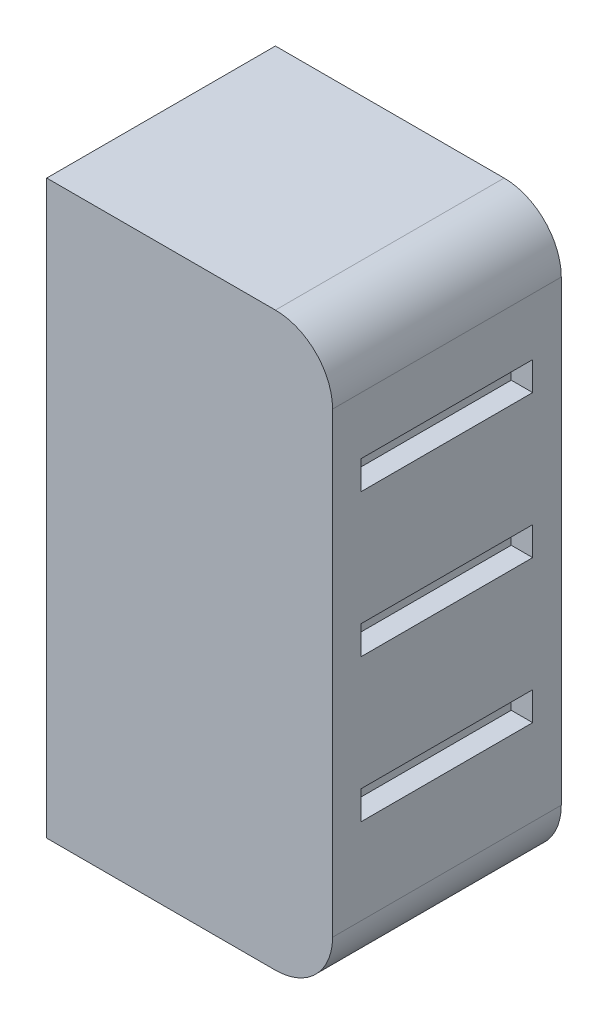
ISO-10303-21;
HEADER;
FILE_DESCRIPTION(('STEP AP214'),'2;1');
FILE_NAME('part.step','',(''),(''),'','','');
FILE_SCHEMA(('AUTOMOTIVE_DESIGN { 1 0 10303 214 1 1 1 1 }'));
ENDSEC;
DATA;
#1=APPLICATION_CONTEXT('core data for automotive mechanical design processes');
#2=APPLICATION_PROTOCOL_DEFINITION('international standard','automotive_design',2000,#1);
#3=PRODUCT_CONTEXT('',#1,'mechanical');
#4=PRODUCT('Part','Part','',(#3));
#5=PRODUCT_RELATED_PRODUCT_CATEGORY('part','',(#4));
#6=PRODUCT_DEFINITION_FORMATION('','',#4);
#7=PRODUCT_DEFINITION_CONTEXT('part definition',#1,'design');
#8=PRODUCT_DEFINITION('design','',#6,#7);
#9=PRODUCT_DEFINITION_SHAPE('','',#8);
#10=(LENGTH_UNIT() NAMED_UNIT(*) SI_UNIT(.MILLI.,.METRE.));
#11=(NAMED_UNIT(*) PLANE_ANGLE_UNIT() SI_UNIT($,.RADIAN.));
#12=(NAMED_UNIT(*) SI_UNIT($,.STERADIAN.) SOLID_ANGLE_UNIT());
#13=UNCERTAINTY_MEASURE_WITH_UNIT(LENGTH_MEASURE(1.E-05),#10,'distance_accuracy_value','');
#14=(GEOMETRIC_REPRESENTATION_CONTEXT(3) GLOBAL_UNCERTAINTY_ASSIGNED_CONTEXT((#13)) GLOBAL_UNIT_ASSIGNED_CONTEXT((#10,
#11,#12)) REPRESENTATION_CONTEXT('',''));
#15=CARTESIAN_POINT('',(0.,0.,0.));
#16=DIRECTION('',(0.,0.,1.));
#17=DIRECTION('',(1.,0.,0.));
#18=AXIS2_PLACEMENT_3D('',#15,#16,#17);
#19=CARTESIAN_POINT('',(4.25,10.,0.));
#20=DIRECTION('',(-1.,0.,0.));
#21=DIRECTION('',(0.,0.,1.));
#22=AXIS2_PLACEMENT_3D('',#19,#20,#21);
#23=PLANE('',#22);
#24=DIRECTION('',(0.,-1.,0.));
#25=VECTOR('',#24,1.);
#26=CARTESIAN_POINT('',(4.25,6.,7.));
#27=LINE('',#26,#25);
#28=CARTESIAN_POINT('',(4.25,6.,7.));
#29=VERTEX_POINT('',#28);
#30=CARTESIAN_POINT('',(4.25,5.,7.));
#31=VERTEX_POINT('',#30);
#32=EDGE_CURVE('E346',#29,#31,#27,.T.);
#33=ORIENTED_EDGE('',*,*,#32,.T.);
#34=DIRECTION('',(0.,0.,-1.));
#35=VECTOR('',#34,1.);
#36=CARTESIAN_POINT('',(4.25,5.,1.));
#37=LINE('',#36,#35);
#38=CARTESIAN_POINT('',(4.25,5.,1.));
#39=VERTEX_POINT('',#38);
#40=EDGE_CURVE('E11',#31,#39,#37,.T.);
#41=ORIENTED_EDGE('',*,*,#40,.T.);
#42=DIRECTION('',(0.,1.,0.));
#43=VECTOR('',#42,1.);
#44=CARTESIAN_POINT('',(4.25,6.,1.));
#45=LINE('',#44,#43);
#46=CARTESIAN_POINT('',(4.25,6.,1.));
#47=VERTEX_POINT('',#46);
#48=EDGE_CURVE('E58',#39,#47,#45,.T.);
#49=ORIENTED_EDGE('',*,*,#48,.T.);
#50=DIRECTION('',(0.,0.,1.));
#51=VECTOR('',#50,1.);
#52=CARTESIAN_POINT('',(4.25,6.,1.));
#53=LINE('',#52,#51);
#54=EDGE_CURVE('E68',#47,#29,#53,.T.);
#55=ORIENTED_EDGE('',*,*,#54,.T.);
#56=EDGE_LOOP('',(#33,#41,#49,#55));
#57=FACE_BOUND('',#56,.T.);
#58=ADVANCED_FACE('F44',(#57),#23,.F.);
#59=CARTESIAN_POINT('',(4.25,5.,1.));
#60=DIRECTION('',(0.,-1.,0.));
#61=DIRECTION('',(0.,0.,-1.));
#62=AXIS2_PLACEMENT_3D('',#59,#60,#61);
#63=PLANE('',#62);
#64=DIRECTION('',(0.,0.,-1.));
#65=VECTOR('',#64,1.);
#66=CARTESIAN_POINT('',(5.,5.,1.));
#67=LINE('',#66,#65);
#68=CARTESIAN_POINT('',(5.,5.,7.));
#69=VERTEX_POINT('',#68);
#70=CARTESIAN_POINT('',(5.,5.,1.));
#71=VERTEX_POINT('',#70);
#72=EDGE_CURVE('E339',#69,#71,#67,.T.);
#73=ORIENTED_EDGE('',*,*,#72,.T.);
#74=DIRECTION('',(1.,0.,0.));
#75=VECTOR('',#74,1.);
#76=CARTESIAN_POINT('',(4.25,5.,1.));
#77=LINE('',#76,#75);
#78=EDGE_CURVE('E52',#39,#71,#77,.T.);
#79=ORIENTED_EDGE('',*,*,#78,.F.);
#80=ORIENTED_EDGE('',*,*,#40,.F.);
#81=DIRECTION('',(1.,0.,0.));
#82=VECTOR('',#81,1.);
#83=CARTESIAN_POINT('',(4.25,5.,7.));
#84=LINE('',#83,#82);
#85=EDGE_CURVE('E342',#31,#69,#84,.T.);
#86=ORIENTED_EDGE('',*,*,#85,.T.);
#87=EDGE_LOOP('',(#73,#79,#80,#86));
#88=FACE_BOUND('',#87,.T.);
#89=ADVANCED_FACE('F368',(#88),#63,.F.);
#90=CARTESIAN_POINT('',(4.25,6.,1.));
#91=DIRECTION('',(0.,0.,-1.));
#92=DIRECTION('',(0.,1.,0.));
#93=AXIS2_PLACEMENT_3D('',#90,#91,#92);
#94=PLANE('',#93);
#95=DIRECTION('',(0.,1.,0.));
#96=VECTOR('',#95,1.);
#97=CARTESIAN_POINT('',(5.,6.,1.));
#98=LINE('',#97,#96);
#99=CARTESIAN_POINT('',(5.,6.,1.));
#100=VERTEX_POINT('',#99);
#101=EDGE_CURVE('E336',#71,#100,#98,.T.);
#102=ORIENTED_EDGE('',*,*,#101,.T.);
#103=DIRECTION('',(1.,0.,0.));
#104=VECTOR('',#103,1.);
#105=CARTESIAN_POINT('',(4.25,6.,1.));
#106=LINE('',#105,#104);
#107=EDGE_CURVE('E358',#47,#100,#106,.T.);
#108=ORIENTED_EDGE('',*,*,#107,.F.);
#109=ORIENTED_EDGE('',*,*,#48,.F.);
#110=ORIENTED_EDGE('',*,*,#78,.T.);
#111=EDGE_LOOP('',(#102,#108,#109,#110));
#112=FACE_BOUND('',#111,.T.);
#113=ADVANCED_FACE('F361',(#112),#94,.F.);
#114=CARTESIAN_POINT('',(4.25,6.,1.));
#115=DIRECTION('',(0.,1.,0.));
#116=DIRECTION('',(0.,0.,1.));
#117=AXIS2_PLACEMENT_3D('',#114,#115,#116);
#118=PLANE('',#117);
#119=DIRECTION('',(0.,0.,1.));
#120=VECTOR('',#119,1.);
#121=CARTESIAN_POINT('',(5.,6.,1.));
#122=LINE('',#121,#120);
#123=CARTESIAN_POINT('',(5.,6.,7.));
#124=VERTEX_POINT('',#123);
#125=EDGE_CURVE('E335',#100,#124,#122,.T.);
#126=ORIENTED_EDGE('',*,*,#125,.T.);
#127=DIRECTION('',(1.,0.,0.));
#128=VECTOR('',#127,1.);
#129=CARTESIAN_POINT('',(4.25,6.,7.));
#130=LINE('',#129,#128);
#131=EDGE_CURVE('E355',#29,#124,#130,.T.);
#132=ORIENTED_EDGE('',*,*,#131,.F.);
#133=ORIENTED_EDGE('',*,*,#54,.F.);
#134=ORIENTED_EDGE('',*,*,#107,.T.);
#135=EDGE_LOOP('',(#126,#132,#133,#134));
#136=FACE_BOUND('',#135,.T.);
#137=ADVANCED_FACE('F371',(#136),#118,.F.);
#138=CARTESIAN_POINT('',(4.25,6.,7.));
#139=DIRECTION('',(0.,0.,1.));
#140=DIRECTION('',(1.,0.,0.));
#141=AXIS2_PLACEMENT_3D('',#138,#139,#140);
#142=PLANE('',#141);
#143=DIRECTION('',(0.,-1.,0.));
#144=VECTOR('',#143,1.);
#145=CARTESIAN_POINT('',(5.,6.,7.));
#146=LINE('',#145,#144);
#147=EDGE_CURVE('E328',#124,#69,#146,.T.);
#148=ORIENTED_EDGE('',*,*,#147,.T.);
#149=ORIENTED_EDGE('',*,*,#85,.F.);
#150=ORIENTED_EDGE('',*,*,#32,.F.);
#151=ORIENTED_EDGE('',*,*,#131,.T.);
#152=EDGE_LOOP('',(#148,#149,#150,#151));
#153=FACE_BOUND('',#152,.T.);
#154=ADVANCED_FACE('F367',(#153),#142,.F.);
#155=CARTESIAN_POINT('',(-5.,-10.,8.));
#156=DIRECTION('',(1.,0.,0.));
#157=DIRECTION('',(0.,0.,-1.));
#158=AXIS2_PLACEMENT_3D('',#155,#156,#157);
#159=PLANE('',#158);
#160=DIRECTION('',(0.,-1.,0.));
#161=VECTOR('',#160,1.);
#162=CARTESIAN_POINT('',(-5.,-10.,0.));
#163=LINE('',#162,#161);
#164=CARTESIAN_POINT('',(-5.,10.,0.));
#165=VERTEX_POINT('',#164);
#166=CARTESIAN_POINT('',(-5.,-10.,0.));
#167=VERTEX_POINT('',#166);
#168=EDGE_CURVE('E258',#165,#167,#163,.T.);
#169=ORIENTED_EDGE('',*,*,#168,.T.);
#170=DIRECTION('',(0.,0.,-1.));
#171=VECTOR('',#170,1.);
#172=CARTESIAN_POINT('',(-5.,-10.,8.));
#173=LINE('',#172,#171);
#174=CARTESIAN_POINT('',(-5.,-10.,8.));
#175=VERTEX_POINT('',#174);
#176=EDGE_CURVE('E298',#175,#167,#173,.T.);
#177=ORIENTED_EDGE('',*,*,#176,.F.);
#178=DIRECTION('',(0.,-1.,0.));
#179=VECTOR('',#178,1.);
#180=CARTESIAN_POINT('',(-5.,-10.,8.));
#181=LINE('',#180,#179);
#182=CARTESIAN_POINT('',(-5.,10.,8.));
#183=VERTEX_POINT('',#182);
#184=EDGE_CURVE('E266',#183,#175,#181,.T.);
#185=ORIENTED_EDGE('',*,*,#184,.F.);
#186=DIRECTION('',(0.,0.,-1.));
#187=VECTOR('',#186,1.);
#188=CARTESIAN_POINT('',(-5.,10.,8.));
#189=LINE('',#188,#187);
#190=EDGE_CURVE('E285',#183,#165,#189,.T.);
#191=ORIENTED_EDGE('',*,*,#190,.T.);
#192=EDGE_LOOP('',(#169,#177,#185,#191));
#193=FACE_BOUND('',#192,.T.);
#194=ADVANCED_FACE('F389',(#193),#159,.F.);
#195=CARTESIAN_POINT('',(5.,-10.,8.));
#196=DIRECTION('',(0.,1.,0.));
#197=DIRECTION('',(-1.,0.,0.));
#198=AXIS2_PLACEMENT_3D('',#195,#196,#197);
#199=PLANE('',#198);
#200=DIRECTION('',(1.,0.,0.));
#201=VECTOR('',#200,1.);
#202=CARTESIAN_POINT('',(5.,-10.,0.));
#203=LINE('',#202,#201);
#204=CARTESIAN_POINT('',(3.,-10.,0.));
#205=VERTEX_POINT('',#204);
#206=EDGE_CURVE('E286',#167,#205,#203,.T.);
#207=ORIENTED_EDGE('',*,*,#206,.T.);
#208=DIRECTION('',(0.,0.,-1.));
#209=VECTOR('',#208,1.);
#210=CARTESIAN_POINT('',(3.,-10.,8.));
#211=LINE('',#210,#209);
#212=CARTESIAN_POINT('',(3.,-10.,8.));
#213=VERTEX_POINT('',#212);
#214=EDGE_CURVE('E316',#205,#213,#211,.F.);
#215=ORIENTED_EDGE('',*,*,#214,.T.);
#216=DIRECTION('',(1.,0.,0.));
#217=VECTOR('',#216,1.);
#218=CARTESIAN_POINT('',(5.,-10.,8.));
#219=LINE('',#218,#217);
#220=EDGE_CURVE('E269',#175,#213,#219,.T.);
#221=ORIENTED_EDGE('',*,*,#220,.F.);
#222=ORIENTED_EDGE('',*,*,#176,.T.);
#223=EDGE_LOOP('',(#207,#215,#221,#222));
#224=FACE_BOUND('',#223,.T.);
#225=ADVANCED_FACE('F376',(#224),#199,.F.);
#226=CARTESIAN_POINT('',(5.,-10.,8.));
#227=DIRECTION('',(-1.,0.,0.));
#228=DIRECTION('',(0.,0.,1.));
#229=AXIS2_PLACEMENT_3D('',#226,#227,#228);
#230=PLANE('',#229);
#231=DIRECTION('',(0.,0.,-1.));
#232=VECTOR('',#231,1.);
#233=CARTESIAN_POINT('',(5.,0.,1.));
#234=LINE('',#233,#232);
#235=CARTESIAN_POINT('',(5.,0.,7.));
#236=VERTEX_POINT('',#235);
#237=CARTESIAN_POINT('',(5.,0.,1.));
#238=VERTEX_POINT('',#237);
#239=EDGE_CURVE('E184',#236,#238,#234,.T.);
#240=ORIENTED_EDGE('',*,*,#239,.F.);
#241=DIRECTION('',(0.,-1.,0.));
#242=VECTOR('',#241,1.);
#243=CARTESIAN_POINT('',(5.,0.999999999999997,7.));
#244=LINE('',#243,#242);
#245=CARTESIAN_POINT('',(5.,0.999999999999997,7.));
#246=VERTEX_POINT('',#245);
#247=EDGE_CURVE('E200',#246,#236,#244,.T.);
#248=ORIENTED_EDGE('',*,*,#247,.F.);
#249=DIRECTION('',(0.,0.,1.));
#250=VECTOR('',#249,1.);
#251=CARTESIAN_POINT('',(5.,0.999999999999997,1.));
#252=LINE('',#251,#250);
#253=CARTESIAN_POINT('',(5.,0.999999999999997,1.));
#254=VERTEX_POINT('',#253);
#255=EDGE_CURVE('E213',#254,#246,#252,.T.);
#256=ORIENTED_EDGE('',*,*,#255,.F.);
#257=DIRECTION('',(0.,1.,0.));
#258=VECTOR('',#257,1.);
#259=CARTESIAN_POINT('',(5.,0.999999999999997,1.));
#260=LINE('',#259,#258);
#261=EDGE_CURVE('E203',#238,#254,#260,.T.);
#262=ORIENTED_EDGE('',*,*,#261,.F.);
#263=EDGE_LOOP('',(#240,#248,#256,#262));
#264=FACE_BOUND('',#263,.T.);
#265=DIRECTION('',(0.,0.,-1.));
#266=VECTOR('',#265,1.);
#267=CARTESIAN_POINT('',(5.,-5.,1.));
#268=LINE('',#267,#266);
#269=CARTESIAN_POINT('',(5.,-5.,7.));
#270=VERTEX_POINT('',#269);
#271=CARTESIAN_POINT('',(5.,-5.,1.));
#272=VERTEX_POINT('',#271);
#273=EDGE_CURVE('E245',#270,#272,#268,.T.);
#274=ORIENTED_EDGE('',*,*,#273,.F.);
#275=DIRECTION('',(0.,-1.,0.));
#276=VECTOR('',#275,1.);
#277=CARTESIAN_POINT('',(5.,-4.,7.));
#278=LINE('',#277,#276);
#279=CARTESIAN_POINT('',(5.,-4.,7.));
#280=VERTEX_POINT('',#279);
#281=EDGE_CURVE('E222',#280,#270,#278,.T.);
#282=ORIENTED_EDGE('',*,*,#281,.F.);
#283=DIRECTION('',(0.,0.,1.));
#284=VECTOR('',#283,1.);
#285=CARTESIAN_POINT('',(5.,-4.,1.));
#286=LINE('',#285,#284);
#287=CARTESIAN_POINT('',(5.,-4.,1.));
#288=VERTEX_POINT('',#287);
#289=EDGE_CURVE('E230',#288,#280,#286,.T.);
#290=ORIENTED_EDGE('',*,*,#289,.F.);
#291=DIRECTION('',(0.,1.,0.));
#292=VECTOR('',#291,1.);
#293=CARTESIAN_POINT('',(5.,-4.,1.));
#294=LINE('',#293,#292);
#295=EDGE_CURVE('E246',#272,#288,#294,.T.);
#296=ORIENTED_EDGE('',*,*,#295,.F.);
#297=EDGE_LOOP('',(#274,#282,#290,#296));
#298=FACE_BOUND('',#297,.T.);
#299=DIRECTION('',(0.,1.,0.));
#300=VECTOR('',#299,1.);
#301=CARTESIAN_POINT('',(5.,-10.,8.));
#302=LINE('',#301,#300);
#303=CARTESIAN_POINT('',(5.,-8.,8.));
#304=VERTEX_POINT('',#303);
#305=CARTESIAN_POINT('',(5.,8.,8.));
#306=VERTEX_POINT('',#305);
#307=EDGE_CURVE('E274',#304,#306,#302,.T.);
#308=ORIENTED_EDGE('',*,*,#307,.F.);
#309=DIRECTION('',(0.,0.,-1.));
#310=VECTOR('',#309,1.);
#311=CARTESIAN_POINT('',(5.,-8.,8.));
#312=LINE('',#311,#310);
#313=CARTESIAN_POINT('',(5.,-8.,0.));
#314=VERTEX_POINT('',#313);
#315=EDGE_CURVE('E308',#304,#314,#312,.T.);
#316=ORIENTED_EDGE('',*,*,#315,.T.);
#317=DIRECTION('',(0.,1.,0.));
#318=VECTOR('',#317,1.);
#319=CARTESIAN_POINT('',(5.,-10.,0.));
#320=LINE('',#319,#318);
#321=CARTESIAN_POINT('',(5.,8.,0.));
#322=VERTEX_POINT('',#321);
#323=EDGE_CURVE('E289',#314,#322,#320,.T.);
#324=ORIENTED_EDGE('',*,*,#323,.T.);
#325=DIRECTION('',(0.,0.,-1.));
#326=VECTOR('',#325,1.);
#327=CARTESIAN_POINT('',(5.,8.,8.));
#328=LINE('',#327,#326);
#329=EDGE_CURVE('E303',#322,#306,#328,.F.);
#330=ORIENTED_EDGE('',*,*,#329,.T.);
#331=EDGE_LOOP('',(#308,#316,#324,#330));
#332=FACE_BOUND('',#331,.T.);
#333=ORIENTED_EDGE('',*,*,#147,.F.);
#334=ORIENTED_EDGE('',*,*,#125,.F.);
#335=ORIENTED_EDGE('',*,*,#101,.F.);
#336=ORIENTED_EDGE('',*,*,#72,.F.);
#337=EDGE_LOOP('',(#333,#334,#335,#336));
#338=FACE_BOUND('',#337,.T.);
#339=ADVANCED_FACE('F373',(#264,#298,#332,#338),#230,.F.);
#340=CARTESIAN_POINT('',(5.,10.,8.));
#341=DIRECTION('',(0.,-1.,0.));
#342=DIRECTION('',(1.,0.,0.));
#343=AXIS2_PLACEMENT_3D('',#340,#341,#342);
#344=PLANE('',#343);
#345=DIRECTION('',(-1.,0.,0.));
#346=VECTOR('',#345,1.);
#347=CARTESIAN_POINT('',(5.,10.,8.));
#348=LINE('',#347,#346);
#349=CARTESIAN_POINT('',(3.,10.,8.));
#350=VERTEX_POINT('',#349);
#351=EDGE_CURVE('E276',#350,#183,#348,.T.);
#352=ORIENTED_EDGE('',*,*,#351,.F.);
#353=DIRECTION('',(0.,0.,-1.));
#354=VECTOR('',#353,1.);
#355=CARTESIAN_POINT('',(3.,10.,8.));
#356=LINE('',#355,#354);
#357=CARTESIAN_POINT('',(3.,10.,0.));
#358=VERTEX_POINT('',#357);
#359=EDGE_CURVE('E324',#350,#358,#356,.T.);
#360=ORIENTED_EDGE('',*,*,#359,.T.);
#361=DIRECTION('',(-1.,0.,0.));
#362=VECTOR('',#361,1.);
#363=CARTESIAN_POINT('',(5.,10.,0.));
#364=LINE('',#363,#362);
#365=EDGE_CURVE('E271',#358,#165,#364,.T.);
#366=ORIENTED_EDGE('',*,*,#365,.T.);
#367=ORIENTED_EDGE('',*,*,#190,.F.);
#368=EDGE_LOOP('',(#352,#360,#366,#367));
#369=FACE_BOUND('',#368,.T.);
#370=ADVANCED_FACE('F374',(#369),#344,.F.);
#371=CARTESIAN_POINT('',(0.,0.,8.));
#372=DIRECTION('',(0.,0.,1.));
#373=DIRECTION('',(1.,0.,0.));
#374=AXIS2_PLACEMENT_3D('',#371,#372,#373);
#375=PLANE('',#374);
#376=ORIENTED_EDGE('',*,*,#220,.T.);
#377=CARTESIAN_POINT('',(3.,-8.,8.));
#378=DIRECTION('',(0.,0.,1.));
#379=DIRECTION('',(1.,0.,0.));
#380=AXIS2_PLACEMENT_3D('',#377,#378,#379);
#381=CIRCLE('',#380,2.);
#382=EDGE_CURVE('E325',#213,#304,#381,.T.);
#383=ORIENTED_EDGE('',*,*,#382,.T.);
#384=ORIENTED_EDGE('',*,*,#307,.T.);
#385=CARTESIAN_POINT('',(3.,8.,8.));
#386=DIRECTION('',(0.,0.,1.));
#387=DIRECTION('',(1.,0.,0.));
#388=AXIS2_PLACEMENT_3D('',#385,#386,#387);
#389=CIRCLE('',#388,2.);
#390=EDGE_CURVE('E317',#306,#350,#389,.T.);
#391=ORIENTED_EDGE('',*,*,#390,.T.);
#392=ORIENTED_EDGE('',*,*,#351,.T.);
#393=ORIENTED_EDGE('',*,*,#184,.T.);
#394=EDGE_LOOP('',(#376,#383,#384,#391,#392,#393));
#395=FACE_BOUND('',#394,.T.);
#396=ADVANCED_FACE('F383',(#395),#375,.T.);
#397=CARTESIAN_POINT('',(0.,0.,0.));
#398=DIRECTION('',(0.,0.,1.));
#399=DIRECTION('',(1.,0.,0.));
#400=AXIS2_PLACEMENT_3D('',#397,#398,#399);
#401=PLANE('',#400);
#402=ORIENTED_EDGE('',*,*,#323,.F.);
#403=CARTESIAN_POINT('',(3.,-8.,0.));
#404=DIRECTION('',(0.,0.,1.));
#405=DIRECTION('',(1.,0.,0.));
#406=AXIS2_PLACEMENT_3D('',#403,#404,#405);
#407=CIRCLE('',#406,2.);
#408=EDGE_CURVE('E311',#314,#205,#407,.F.);
#409=ORIENTED_EDGE('',*,*,#408,.T.);
#410=ORIENTED_EDGE('',*,*,#206,.F.);
#411=ORIENTED_EDGE('',*,*,#168,.F.);
#412=ORIENTED_EDGE('',*,*,#365,.F.);
#413=CARTESIAN_POINT('',(3.,8.,0.));
#414=DIRECTION('',(0.,0.,1.));
#415=DIRECTION('',(1.,0.,0.));
#416=AXIS2_PLACEMENT_3D('',#413,#414,#415);
#417=CIRCLE('',#416,2.);
#418=EDGE_CURVE('E309',#358,#322,#417,.F.);
#419=ORIENTED_EDGE('',*,*,#418,.T.);
#420=EDGE_LOOP('',(#402,#409,#410,#411,#412,#419));
#421=FACE_BOUND('',#420,.T.);
#422=ADVANCED_FACE('F413',(#421),#401,.F.);
#423=CARTESIAN_POINT('',(3.,-8.,8.));
#424=DIRECTION('',(0.,0.,-1.));
#425=DIRECTION('',(-1.,0.,0.));
#426=AXIS2_PLACEMENT_3D('',#423,#424,#425);
#427=CYLINDRICAL_SURFACE('',#426,2.);
#428=ORIENTED_EDGE('',*,*,#382,.F.);
#429=ORIENTED_EDGE('',*,*,#214,.F.);
#430=ORIENTED_EDGE('',*,*,#408,.F.);
#431=ORIENTED_EDGE('',*,*,#315,.F.);
#432=EDGE_LOOP('',(#428,#429,#430,#431));
#433=FACE_BOUND('',#432,.T.);
#434=ADVANCED_FACE('F408',(#433),#427,.T.);
#435=CARTESIAN_POINT('',(3.,8.,8.));
#436=DIRECTION('',(0.,0.,-1.));
#437=DIRECTION('',(-1.,0.,0.));
#438=AXIS2_PLACEMENT_3D('',#435,#436,#437);
#439=CYLINDRICAL_SURFACE('',#438,2.);
#440=ORIENTED_EDGE('',*,*,#390,.F.);
#441=ORIENTED_EDGE('',*,*,#329,.F.);
#442=ORIENTED_EDGE('',*,*,#418,.F.);
#443=ORIENTED_EDGE('',*,*,#359,.F.);
#444=EDGE_LOOP('',(#440,#441,#442,#443));
#445=FACE_BOUND('',#444,.T.);
#446=ADVANCED_FACE('F403',(#445),#439,.T.);
#447=CARTESIAN_POINT('',(4.25,-4.,7.));
#448=DIRECTION('',(0.,0.,1.));
#449=DIRECTION('',(1.,0.,0.));
#450=AXIS2_PLACEMENT_3D('',#447,#448,#449);
#451=PLANE('',#450);
#452=ORIENTED_EDGE('',*,*,#281,.T.);
#453=DIRECTION('',(1.,0.,0.));
#454=VECTOR('',#453,1.);
#455=CARTESIAN_POINT('',(4.25,-5.,7.));
#456=LINE('',#455,#454);
#457=CARTESIAN_POINT('',(4.25,-5.,7.));
#458=VERTEX_POINT('',#457);
#459=EDGE_CURVE('E239',#458,#270,#456,.T.);
#460=ORIENTED_EDGE('',*,*,#459,.F.);
#461=DIRECTION('',(0.,-1.,0.));
#462=VECTOR('',#461,1.);
#463=CARTESIAN_POINT('',(4.25,-4.,7.));
#464=LINE('',#463,#462);
#465=CARTESIAN_POINT('',(4.25,-4.,7.));
#466=VERTEX_POINT('',#465);
#467=EDGE_CURVE('E225',#466,#458,#464,.T.);
#468=ORIENTED_EDGE('',*,*,#467,.F.);
#469=DIRECTION('',(1.,0.,0.));
#470=VECTOR('',#469,1.);
#471=CARTESIAN_POINT('',(4.25,-4.,7.));
#472=LINE('',#471,#470);
#473=EDGE_CURVE('E251',#466,#280,#472,.T.);
#474=ORIENTED_EDGE('',*,*,#473,.T.);
#475=EDGE_LOOP('',(#452,#460,#468,#474));
#476=FACE_BOUND('',#475,.T.);
#477=ADVANCED_FACE('F407',(#476),#451,.F.);
#478=CARTESIAN_POINT('',(4.25,-4.,1.));
#479=DIRECTION('',(0.,1.,0.));
#480=DIRECTION('',(0.,0.,1.));
#481=AXIS2_PLACEMENT_3D('',#478,#479,#480);
#482=PLANE('',#481);
#483=ORIENTED_EDGE('',*,*,#289,.T.);
#484=ORIENTED_EDGE('',*,*,#473,.F.);
#485=DIRECTION('',(0.,0.,1.));
#486=VECTOR('',#485,1.);
#487=CARTESIAN_POINT('',(4.25,-4.,1.));
#488=LINE('',#487,#486);
#489=CARTESIAN_POINT('',(4.25,-4.,1.));
#490=VERTEX_POINT('',#489);
#491=EDGE_CURVE('E234',#490,#466,#488,.T.);
#492=ORIENTED_EDGE('',*,*,#491,.F.);
#493=DIRECTION('',(1.,0.,0.));
#494=VECTOR('',#493,1.);
#495=CARTESIAN_POINT('',(4.25,-4.,1.));
#496=LINE('',#495,#494);
#497=EDGE_CURVE('E260',#490,#288,#496,.T.);
#498=ORIENTED_EDGE('',*,*,#497,.T.);
#499=EDGE_LOOP('',(#483,#484,#492,#498));
#500=FACE_BOUND('',#499,.T.);
#501=ADVANCED_FACE('F443',(#500),#482,.F.);
#502=CARTESIAN_POINT('',(4.25,-4.,1.));
#503=DIRECTION('',(0.,0.,-1.));
#504=DIRECTION('',(0.,1.,0.));
#505=AXIS2_PLACEMENT_3D('',#502,#503,#504);
#506=PLANE('',#505);
#507=ORIENTED_EDGE('',*,*,#295,.T.);
#508=ORIENTED_EDGE('',*,*,#497,.F.);
#509=DIRECTION('',(0.,1.,0.));
#510=VECTOR('',#509,1.);
#511=CARTESIAN_POINT('',(4.25,-4.,1.));
#512=LINE('',#511,#510);
#513=CARTESIAN_POINT('',(4.25,-5.,1.));
#514=VERTEX_POINT('',#513);
#515=EDGE_CURVE('E231',#514,#490,#512,.T.);
#516=ORIENTED_EDGE('',*,*,#515,.F.);
#517=DIRECTION('',(1.,0.,0.));
#518=VECTOR('',#517,1.);
#519=CARTESIAN_POINT('',(4.25,-5.,1.));
#520=LINE('',#519,#518);
#521=EDGE_CURVE('E257',#514,#272,#520,.T.);
#522=ORIENTED_EDGE('',*,*,#521,.T.);
#523=EDGE_LOOP('',(#507,#508,#516,#522));
#524=FACE_BOUND('',#523,.T.);
#525=ADVANCED_FACE('F451',(#524),#506,.F.);
#526=CARTESIAN_POINT('',(4.25,-5.,1.));
#527=DIRECTION('',(0.,-1.,0.));
#528=DIRECTION('',(0.,0.,-1.));
#529=AXIS2_PLACEMENT_3D('',#526,#527,#528);
#530=PLANE('',#529);
#531=ORIENTED_EDGE('',*,*,#273,.T.);
#532=ORIENTED_EDGE('',*,*,#521,.F.);
#533=DIRECTION('',(0.,0.,-1.));
#534=VECTOR('',#533,1.);
#535=CARTESIAN_POINT('',(4.25,-5.,1.));
#536=LINE('',#535,#534);
#537=EDGE_CURVE('E226',#458,#514,#536,.T.);
#538=ORIENTED_EDGE('',*,*,#537,.F.);
#539=ORIENTED_EDGE('',*,*,#459,.T.);
#540=EDGE_LOOP('',(#531,#532,#538,#539));
#541=FACE_BOUND('',#540,.T.);
#542=ADVANCED_FACE('F450',(#541),#530,.F.);
#543=CARTESIAN_POINT('',(4.25,0.,0.));
#544=DIRECTION('',(-1.,0.,0.));
#545=DIRECTION('',(0.,0.,1.));
#546=AXIS2_PLACEMENT_3D('',#543,#544,#545);
#547=PLANE('',#546);
#548=ORIENTED_EDGE('',*,*,#467,.T.);
#549=ORIENTED_EDGE('',*,*,#537,.T.);
#550=ORIENTED_EDGE('',*,*,#515,.T.);
#551=ORIENTED_EDGE('',*,*,#491,.T.);
#552=EDGE_LOOP('',(#548,#549,#550,#551));
#553=FACE_BOUND('',#552,.T.);
#554=ADVANCED_FACE('F449',(#553),#547,.F.);
#555=CARTESIAN_POINT('',(4.25,0.999999999999997,7.));
#556=DIRECTION('',(0.,0.,1.));
#557=DIRECTION('',(1.,0.,0.));
#558=AXIS2_PLACEMENT_3D('',#555,#556,#557);
#559=PLANE('',#558);
#560=ORIENTED_EDGE('',*,*,#247,.T.);
#561=DIRECTION('',(1.,0.,0.));
#562=VECTOR('',#561,1.);
#563=CARTESIAN_POINT('',(4.25,0.,7.));
#564=LINE('',#563,#562);
#565=CARTESIAN_POINT('',(4.25,0.,7.));
#566=VERTEX_POINT('',#565);
#567=EDGE_CURVE('E189',#566,#236,#564,.T.);
#568=ORIENTED_EDGE('',*,*,#567,.F.);
#569=DIRECTION('',(0.,-1.,0.));
#570=VECTOR('',#569,1.);
#571=CARTESIAN_POINT('',(4.25,0.999999999999997,7.));
#572=LINE('',#571,#570);
#573=CARTESIAN_POINT('',(4.25,0.999999999999997,7.));
#574=VERTEX_POINT('',#573);
#575=EDGE_CURVE('E175',#574,#566,#572,.T.);
#576=ORIENTED_EDGE('',*,*,#575,.F.);
#577=DIRECTION('',(1.,0.,0.));
#578=VECTOR('',#577,1.);
#579=CARTESIAN_POINT('',(4.25,0.999999999999997,7.));
#580=LINE('',#579,#578);
#581=EDGE_CURVE('E216',#574,#246,#580,.T.);
#582=ORIENTED_EDGE('',*,*,#581,.T.);
#583=EDGE_LOOP('',(#560,#568,#576,#582));
#584=FACE_BOUND('',#583,.T.);
#585=ADVANCED_FACE('F197',(#584),#559,.F.);
#586=CARTESIAN_POINT('',(4.25,0.999999999999997,1.));
#587=DIRECTION('',(0.,1.,0.));
#588=DIRECTION('',(0.,0.,1.));
#589=AXIS2_PLACEMENT_3D('',#586,#587,#588);
#590=PLANE('',#589);
#591=ORIENTED_EDGE('',*,*,#255,.T.);
#592=ORIENTED_EDGE('',*,*,#581,.F.);
#593=DIRECTION('',(0.,0.,1.));
#594=VECTOR('',#593,1.);
#595=CARTESIAN_POINT('',(4.25,0.999999999999997,1.));
#596=LINE('',#595,#594);
#597=CARTESIAN_POINT('',(4.25,0.999999999999997,1.));
#598=VERTEX_POINT('',#597);
#599=EDGE_CURVE('E178',#598,#574,#596,.T.);
#600=ORIENTED_EDGE('',*,*,#599,.F.);
#601=DIRECTION('',(1.,0.,0.));
#602=VECTOR('',#601,1.);
#603=CARTESIAN_POINT('',(4.25,0.999999999999997,1.));
#604=LINE('',#603,#602);
#605=EDGE_CURVE('E202',#598,#254,#604,.T.);
#606=ORIENTED_EDGE('',*,*,#605,.T.);
#607=EDGE_LOOP('',(#591,#592,#600,#606));
#608=FACE_BOUND('',#607,.T.);
#609=ADVANCED_FACE('F465',(#608),#590,.F.);
#610=CARTESIAN_POINT('',(4.25,0.999999999999997,1.));
#611=DIRECTION('',(0.,0.,-1.));
#612=DIRECTION('',(0.,1.,0.));
#613=AXIS2_PLACEMENT_3D('',#610,#611,#612);
#614=PLANE('',#613);
#615=ORIENTED_EDGE('',*,*,#261,.T.);
#616=ORIENTED_EDGE('',*,*,#605,.F.);
#617=DIRECTION('',(0.,1.,0.));
#618=VECTOR('',#617,1.);
#619=CARTESIAN_POINT('',(4.25,0.999999999999997,1.));
#620=LINE('',#619,#618);
#621=CARTESIAN_POINT('',(4.25,0.,1.));
#622=VERTEX_POINT('',#621);
#623=EDGE_CURVE('E194',#622,#598,#620,.T.);
#624=ORIENTED_EDGE('',*,*,#623,.F.);
#625=DIRECTION('',(1.,0.,0.));
#626=VECTOR('',#625,1.);
#627=CARTESIAN_POINT('',(4.25,0.,1.));
#628=LINE('',#627,#626);
#629=EDGE_CURVE('E193',#622,#238,#628,.T.);
#630=ORIENTED_EDGE('',*,*,#629,.T.);
#631=EDGE_LOOP('',(#615,#616,#624,#630));
#632=FACE_BOUND('',#631,.T.);
#633=ADVANCED_FACE('F464',(#632),#614,.F.);
#634=CARTESIAN_POINT('',(4.25,0.,1.));
#635=DIRECTION('',(0.,-1.,0.));
#636=DIRECTION('',(0.,0.,-1.));
#637=AXIS2_PLACEMENT_3D('',#634,#635,#636);
#638=PLANE('',#637);
#639=ORIENTED_EDGE('',*,*,#239,.T.);
#640=ORIENTED_EDGE('',*,*,#629,.F.);
#641=DIRECTION('',(0.,0.,-1.));
#642=VECTOR('',#641,1.);
#643=CARTESIAN_POINT('',(4.25,0.,1.));
#644=LINE('',#643,#642);
#645=EDGE_CURVE('E174',#566,#622,#644,.T.);
#646=ORIENTED_EDGE('',*,*,#645,.F.);
#647=ORIENTED_EDGE('',*,*,#567,.T.);
#648=EDGE_LOOP('',(#639,#640,#646,#647));
#649=FACE_BOUND('',#648,.T.);
#650=ADVANCED_FACE('F188',(#649),#638,.F.);
#651=CARTESIAN_POINT('',(4.25,5.,0.));
#652=DIRECTION('',(-1.,0.,0.));
#653=DIRECTION('',(0.,0.,1.));
#654=AXIS2_PLACEMENT_3D('',#651,#652,#653);
#655=PLANE('',#654);
#656=ORIENTED_EDGE('',*,*,#575,.T.);
#657=ORIENTED_EDGE('',*,*,#645,.T.);
#658=ORIENTED_EDGE('',*,*,#623,.T.);
#659=ORIENTED_EDGE('',*,*,#599,.T.);
#660=EDGE_LOOP('',(#656,#657,#658,#659));
#661=FACE_BOUND('',#660,.T.);
#662=ADVANCED_FACE('F173',(#661),#655,.F.);
#663=CLOSED_SHELL('',(#58,#89,#113,#137,#154,#194,#225,#339,#370,#396,#422,#434,#446,#477,#501,
#525,#542,#554,#585,#609,#633,#650,#662));
#664=MANIFOLD_SOLID_BREP('B2',#663);
#665=ADVANCED_BREP_SHAPE_REPRESENTATION('',(#18,#664),#14);
#666=SHAPE_DEFINITION_REPRESENTATION(#9,#665);
ENDSEC;
END-ISO-10303-21;
